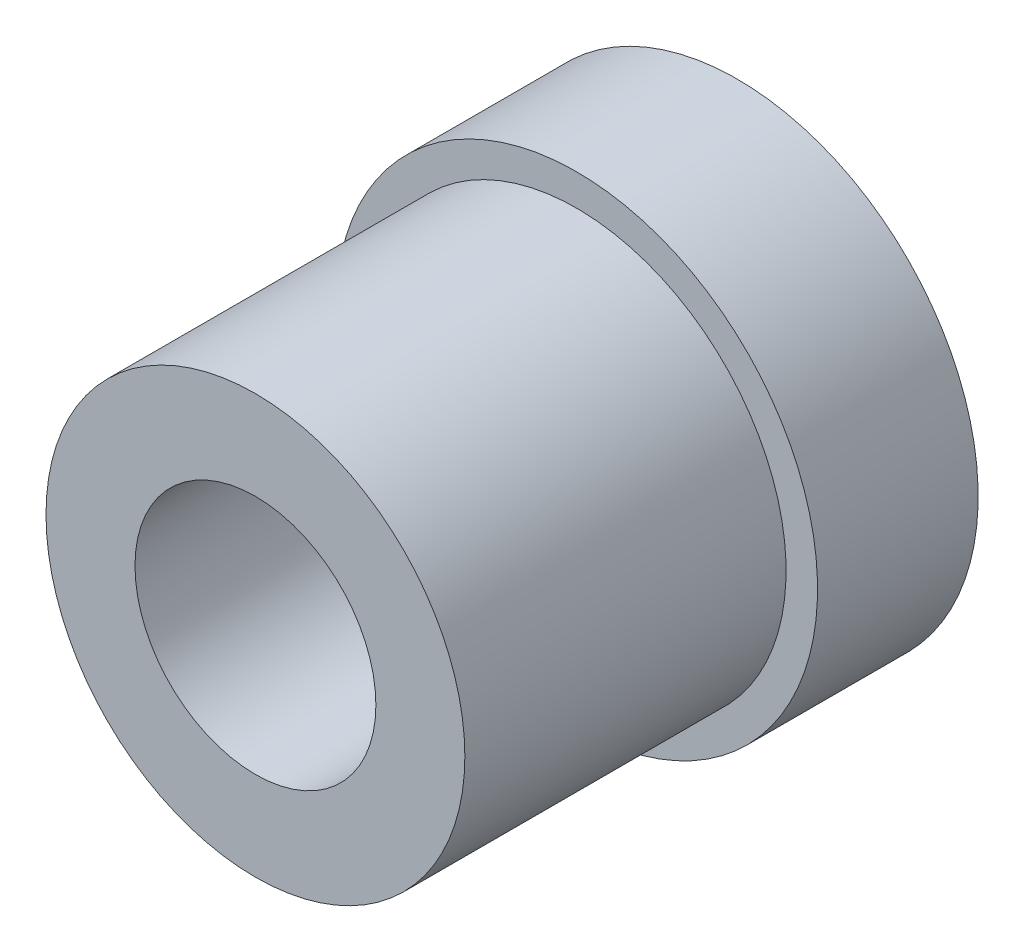
ISO-10303-21;
HEADER;
FILE_DESCRIPTION(('STEP AP214'),'2;1');
FILE_NAME('part.step','',(''),(''),'','','');
FILE_SCHEMA(('AUTOMOTIVE_DESIGN { 1 0 10303 214 1 1 1 1 }'));
ENDSEC;
DATA;
#1=APPLICATION_CONTEXT('core data for automotive mechanical design processes');
#2=APPLICATION_PROTOCOL_DEFINITION('international standard','automotive_design',2000,#1);
#3=PRODUCT_CONTEXT('',#1,'mechanical');
#4=PRODUCT('Part','Part','',(#3));
#5=PRODUCT_RELATED_PRODUCT_CATEGORY('part','',(#4));
#6=PRODUCT_DEFINITION_FORMATION('','',#4);
#7=PRODUCT_DEFINITION_CONTEXT('part definition',#1,'design');
#8=PRODUCT_DEFINITION('design','',#6,#7);
#9=PRODUCT_DEFINITION_SHAPE('','',#8);
#10=(LENGTH_UNIT() NAMED_UNIT(*) SI_UNIT(.MILLI.,.METRE.));
#11=(NAMED_UNIT(*) PLANE_ANGLE_UNIT() SI_UNIT($,.RADIAN.));
#12=(NAMED_UNIT(*) SI_UNIT($,.STERADIAN.) SOLID_ANGLE_UNIT());
#13=UNCERTAINTY_MEASURE_WITH_UNIT(LENGTH_MEASURE(1.E-05),#10,'distance_accuracy_value','');
#14=(GEOMETRIC_REPRESENTATION_CONTEXT(3) GLOBAL_UNCERTAINTY_ASSIGNED_CONTEXT((#13)) GLOBAL_UNIT_ASSIGNED_CONTEXT((#10,
#11,#12)) REPRESENTATION_CONTEXT('',''));
#15=CARTESIAN_POINT('',(0.,0.,0.));
#16=DIRECTION('',(0.,0.,1.));
#17=DIRECTION('',(1.,0.,0.));
#18=AXIS2_PLACEMENT_3D('',#15,#16,#17);
#19=CARTESIAN_POINT('',(0.,0.,12.7));
#20=DIRECTION('',(0.,0.,1.));
#21=DIRECTION('',(1.,0.,0.));
#22=AXIS2_PLACEMENT_3D('',#19,#20,#21);
#23=PLANE('',#22);
#24=CARTESIAN_POINT('',(0.,0.,12.7));
#25=DIRECTION('',(0.,0.,1.));
#26=DIRECTION('',(1.,0.,0.));
#27=AXIS2_PLACEMENT_3D('',#24,#25,#26);
#28=CIRCLE('',#27,8.2804);
#29=CARTESIAN_POINT('',(8.2804,0.,12.7));
#30=VERTEX_POINT('',#29);
#31=EDGE_CURVE('E10',#30,#30,#28,.T.);
#32=ORIENTED_EDGE('',*,*,#31,.T.);
#33=EDGE_LOOP('',(#32));
#34=FACE_BOUND('',#33,.T.);
#35=CARTESIAN_POINT('',(0.,0.,12.7));
#36=DIRECTION('',(0.,0.,1.));
#37=DIRECTION('',(1.,0.,0.));
#38=AXIS2_PLACEMENT_3D('',#35,#36,#37);
#39=CIRCLE('',#38,4.7625);
#40=CARTESIAN_POINT('',(4.7625,0.,12.7));
#41=VERTEX_POINT('',#40);
#42=EDGE_CURVE('E37',#41,#41,#39,.T.);
#43=ORIENTED_EDGE('',*,*,#42,.F.);
#44=EDGE_LOOP('',(#43));
#45=FACE_BOUND('',#44,.T.);
#46=ADVANCED_FACE('F30',(#34,#45),#23,.T.);
#47=CARTESIAN_POINT('',(0.,0.,12.7));
#48=DIRECTION('',(0.,0.,-1.));
#49=DIRECTION('',(-1.,0.,0.));
#50=AXIS2_PLACEMENT_3D('',#47,#48,#49);
#51=CYLINDRICAL_SURFACE('',#50,8.2804);
#52=ORIENTED_EDGE('',*,*,#31,.F.);
#53=EDGE_LOOP('',(#52));
#54=FACE_BOUND('',#53,.T.);
#55=CARTESIAN_POINT('',(0.,0.,0.));
#56=DIRECTION('',(0.,0.,-1.));
#57=DIRECTION('',(-1.,0.,0.));
#58=AXIS2_PLACEMENT_3D('',#55,#56,#57);
#59=CIRCLE('',#58,8.2804);
#60=CARTESIAN_POINT('',(-8.2804,0.,0.));
#61=VERTEX_POINT('',#60);
#62=EDGE_CURVE('E41',#61,#61,#59,.T.);
#63=ORIENTED_EDGE('',*,*,#62,.F.);
#64=EDGE_LOOP('',(#63));
#65=FACE_BOUND('',#64,.T.);
#66=ADVANCED_FACE('F32',(#54,#65),#51,.T.);
#67=CARTESIAN_POINT('',(0.,0.,12.7));
#68=DIRECTION('',(0.,0.,-1.));
#69=DIRECTION('',(-1.,0.,0.));
#70=AXIS2_PLACEMENT_3D('',#67,#68,#69);
#71=CYLINDRICAL_SURFACE('',#70,4.7625);
#72=ORIENTED_EDGE('',*,*,#42,.T.);
#73=EDGE_LOOP('',(#72));
#74=FACE_BOUND('',#73,.T.);
#75=CARTESIAN_POINT('',(0.,0.,-6.35));
#76=DIRECTION('',(0.,0.,-1.));
#77=DIRECTION('',(-1.,0.,0.));
#78=AXIS2_PLACEMENT_3D('',#75,#76,#77);
#79=CIRCLE('',#78,4.7625);
#80=CARTESIAN_POINT('',(-4.7625,0.,-6.35));
#81=VERTEX_POINT('',#80);
#82=EDGE_CURVE('E51',#81,#81,#79,.T.);
#83=ORIENTED_EDGE('',*,*,#82,.T.);
#84=EDGE_LOOP('',(#83));
#85=FACE_BOUND('',#84,.T.);
#86=ADVANCED_FACE('F57',(#74,#85),#71,.F.);
#87=CARTESIAN_POINT('',(0.,0.,0.));
#88=DIRECTION('',(0.,0.,-1.));
#89=DIRECTION('',(-1.,0.,0.));
#90=AXIS2_PLACEMENT_3D('',#87,#88,#89);
#91=PLANE('',#90);
#92=CARTESIAN_POINT('',(0.,0.,0.));
#93=DIRECTION('',(0.,0.,-1.));
#94=DIRECTION('',(-1.,0.,0.));
#95=AXIS2_PLACEMENT_3D('',#92,#93,#94);
#96=CIRCLE('',#95,9.525);
#97=CARTESIAN_POINT('',(-9.525,0.,0.));
#98=VERTEX_POINT('',#97);
#99=EDGE_CURVE('E48',#98,#98,#96,.T.);
#100=ORIENTED_EDGE('',*,*,#99,.F.);
#101=EDGE_LOOP('',(#100));
#102=FACE_BOUND('',#101,.T.);
#103=ORIENTED_EDGE('',*,*,#62,.T.);
#104=EDGE_LOOP('',(#103));
#105=FACE_BOUND('',#104,.T.);
#106=ADVANCED_FACE('F62',(#102,#105),#91,.F.);
#107=CARTESIAN_POINT('',(0.,0.,-6.35));
#108=DIRECTION('',(0.,0.,-1.));
#109=DIRECTION('',(-1.,0.,0.));
#110=AXIS2_PLACEMENT_3D('',#107,#108,#109);
#111=PLANE('',#110);
#112=CARTESIAN_POINT('',(0.,0.,-6.35));
#113=DIRECTION('',(0.,0.,-1.));
#114=DIRECTION('',(-1.,0.,0.));
#115=AXIS2_PLACEMENT_3D('',#112,#113,#114);
#116=CIRCLE('',#115,9.525);
#117=CARTESIAN_POINT('',(-9.525,0.,-6.35));
#118=VERTEX_POINT('',#117);
#119=EDGE_CURVE('E45',#118,#118,#116,.T.);
#120=ORIENTED_EDGE('',*,*,#119,.T.);
#121=EDGE_LOOP('',(#120));
#122=FACE_BOUND('',#121,.T.);
#123=ORIENTED_EDGE('',*,*,#82,.F.);
#124=EDGE_LOOP('',(#123));
#125=FACE_BOUND('',#124,.T.);
#126=ADVANCED_FACE('F59',(#122,#125),#111,.T.);
#127=CARTESIAN_POINT('',(0.,0.,-6.35));
#128=DIRECTION('',(0.,0.,1.));
#129=DIRECTION('',(1.,0.,0.));
#130=AXIS2_PLACEMENT_3D('',#127,#128,#129);
#131=CYLINDRICAL_SURFACE('',#130,9.525);
#132=ORIENTED_EDGE('',*,*,#119,.F.);
#133=EDGE_LOOP('',(#132));
#134=FACE_BOUND('',#133,.T.);
#135=ORIENTED_EDGE('',*,*,#99,.T.);
#136=EDGE_LOOP('',(#135));
#137=FACE_BOUND('',#136,.T.);
#138=ADVANCED_FACE('F61',(#134,#137),#131,.T.);
#139=CLOSED_SHELL('',(#46,#66,#86,#106,#126,#138));
#140=MANIFOLD_SOLID_BREP('B2',#139);
#141=ADVANCED_BREP_SHAPE_REPRESENTATION('',(#18,#140),#14);
#142=SHAPE_DEFINITION_REPRESENTATION(#9,#141);
ENDSEC;
END-ISO-10303-21;
